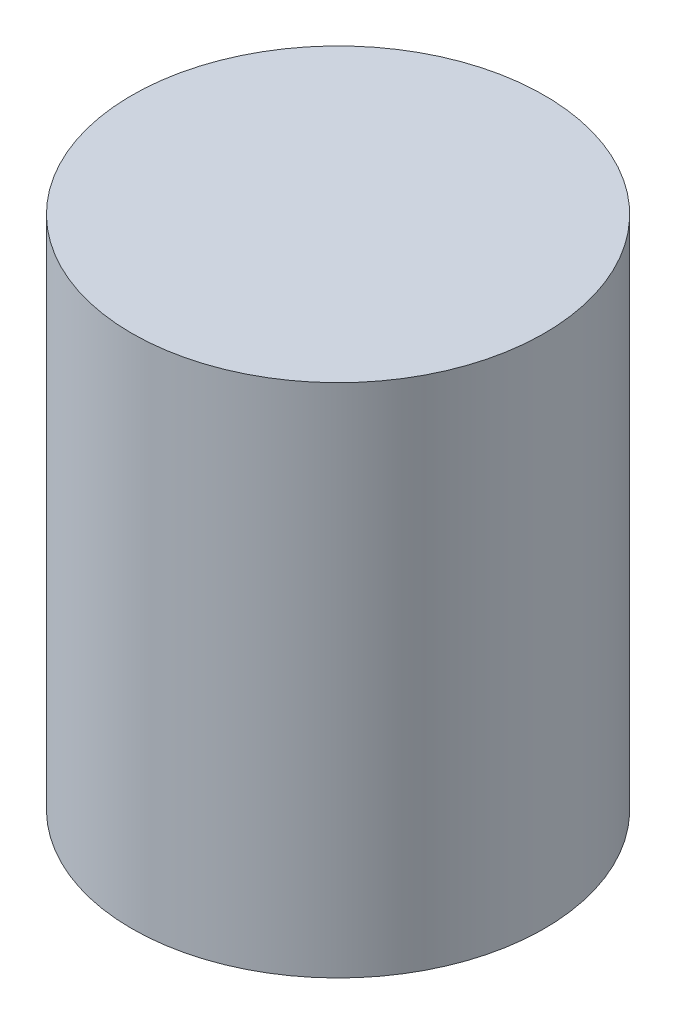
ISO-10303-21;
HEADER;
FILE_DESCRIPTION(('STEP AP214'),'2;1');
FILE_NAME('part.step','',(''),(''),'','','');
FILE_SCHEMA(('AUTOMOTIVE_DESIGN { 1 0 10303 214 1 1 1 1 }'));
ENDSEC;
DATA;
#1=APPLICATION_CONTEXT('core data for automotive mechanical design processes');
#2=APPLICATION_PROTOCOL_DEFINITION('international standard','automotive_design',2000,#1);
#3=PRODUCT_CONTEXT('',#1,'mechanical');
#4=PRODUCT('Part','Part','',(#3));
#5=PRODUCT_RELATED_PRODUCT_CATEGORY('part','',(#4));
#6=PRODUCT_DEFINITION_FORMATION('','',#4);
#7=PRODUCT_DEFINITION_CONTEXT('part definition',#1,'design');
#8=PRODUCT_DEFINITION('design','',#6,#7);
#9=PRODUCT_DEFINITION_SHAPE('','',#8);
#10=(LENGTH_UNIT() NAMED_UNIT(*) SI_UNIT(.MILLI.,.METRE.));
#11=(NAMED_UNIT(*) PLANE_ANGLE_UNIT() SI_UNIT($,.RADIAN.));
#12=(NAMED_UNIT(*) SI_UNIT($,.STERADIAN.) SOLID_ANGLE_UNIT());
#13=UNCERTAINTY_MEASURE_WITH_UNIT(LENGTH_MEASURE(1.E-05),#10,'distance_accuracy_value','');
#14=(GEOMETRIC_REPRESENTATION_CONTEXT(3) GLOBAL_UNCERTAINTY_ASSIGNED_CONTEXT((#13)) GLOBAL_UNIT_ASSIGNED_CONTEXT((#10,
#11,#12)) REPRESENTATION_CONTEXT('',''));
#15=CARTESIAN_POINT('',(0.,0.,0.));
#16=DIRECTION('',(0.,0.,1.));
#17=DIRECTION('',(1.,0.,0.));
#18=AXIS2_PLACEMENT_3D('',#15,#16,#17);
#19=CARTESIAN_POINT('',(350.,1070.,-280.));
#20=DIRECTION('',(0.,-1.,0.));
#21=DIRECTION('',(0.,0.,-1.));
#22=AXIS2_PLACEMENT_3D('',#19,#20,#21);
#23=CYLINDRICAL_SURFACE('',#22,20.);
#24=CARTESIAN_POINT('',(350.,1070.,-280.));
#25=DIRECTION('',(0.,1.,0.));
#26=DIRECTION('',(0.,0.,1.));
#27=AXIS2_PLACEMENT_3D('',#24,#25,#26);
#28=CIRCLE('',#27,20.);
#29=CARTESIAN_POINT('',(350.,1070.,-260.));
#30=VERTEX_POINT('',#29);
#31=EDGE_CURVE('E10',#30,#30,#28,.T.);
#32=ORIENTED_EDGE('',*,*,#31,.F.);
#33=EDGE_LOOP('',(#32));
#34=FACE_BOUND('',#33,.T.);
#35=CARTESIAN_POINT('',(350.,1020.,-280.));
#36=DIRECTION('',(0.,1.,0.));
#37=DIRECTION('',(0.,0.,1.));
#38=AXIS2_PLACEMENT_3D('',#35,#36,#37);
#39=CIRCLE('',#38,20.);
#40=CARTESIAN_POINT('',(350.,1020.,-260.));
#41=VERTEX_POINT('',#40);
#42=EDGE_CURVE('E40',#41,#41,#39,.T.);
#43=ORIENTED_EDGE('',*,*,#42,.T.);
#44=EDGE_LOOP('',(#43));
#45=FACE_BOUND('',#44,.T.);
#46=ADVANCED_FACE('F37',(#34,#45),#23,.T.);
#47=CARTESIAN_POINT('',(350.,1070.,-280.));
#48=DIRECTION('',(0.,1.,0.));
#49=DIRECTION('',(0.,0.,1.));
#50=AXIS2_PLACEMENT_3D('',#47,#48,#49);
#51=PLANE('',#50);
#52=ORIENTED_EDGE('',*,*,#31,.T.);
#53=EDGE_LOOP('',(#52));
#54=FACE_BOUND('',#53,.T.);
#55=ADVANCED_FACE('F52',(#54),#51,.T.);
#56=CARTESIAN_POINT('',(350.,1020.,-280.));
#57=DIRECTION('',(0.,1.,0.));
#58=DIRECTION('',(0.,0.,1.));
#59=AXIS2_PLACEMENT_3D('',#56,#57,#58);
#60=PLANE('',#59);
#61=ORIENTED_EDGE('',*,*,#42,.F.);
#62=EDGE_LOOP('',(#61));
#63=FACE_BOUND('',#62,.T.);
#64=ADVANCED_FACE('F50',(#63),#60,.F.);
#65=CLOSED_SHELL('',(#46,#55,#64));
#66=MANIFOLD_SOLID_BREP('B2',#65);
#67=ADVANCED_BREP_SHAPE_REPRESENTATION('',(#18,#66),#14);
#68=SHAPE_DEFINITION_REPRESENTATION(#9,#67);
ENDSEC;
END-ISO-10303-21;
